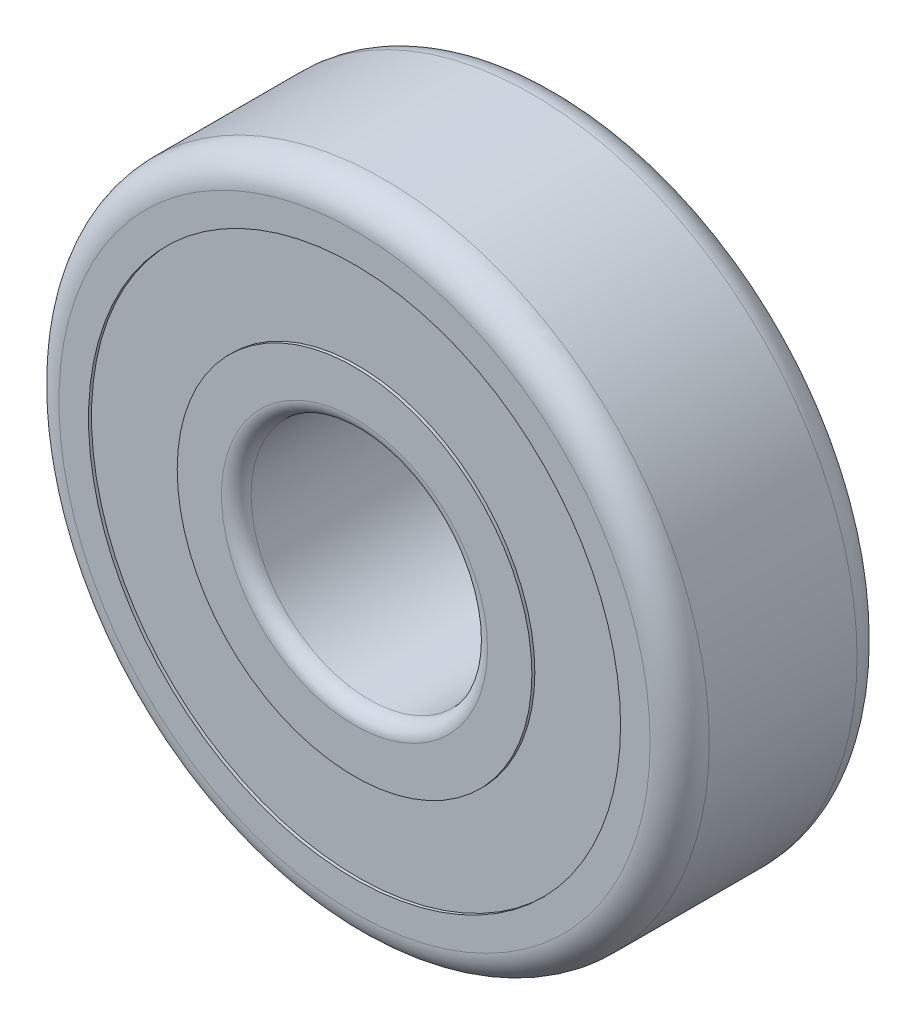
ISO-10303-21;
HEADER;
FILE_DESCRIPTION(('STEP AP214'),'2;1');
FILE_NAME('part.step','',(''),(''),'','','');
FILE_SCHEMA(('AUTOMOTIVE_DESIGN { 1 0 10303 214 1 1 1 1 }'));
ENDSEC;
DATA;
#1=APPLICATION_CONTEXT('core data for automotive mechanical design processes');
#2=APPLICATION_PROTOCOL_DEFINITION('international standard','automotive_design',2000,#1);
#3=PRODUCT_CONTEXT('',#1,'mechanical');
#4=PRODUCT('Part','Part','',(#3));
#5=PRODUCT_RELATED_PRODUCT_CATEGORY('part','',(#4));
#6=PRODUCT_DEFINITION_FORMATION('','',#4);
#7=PRODUCT_DEFINITION_CONTEXT('part definition',#1,'design');
#8=PRODUCT_DEFINITION('design','',#6,#7);
#9=PRODUCT_DEFINITION_SHAPE('','',#8);
#10=(LENGTH_UNIT() NAMED_UNIT(*) SI_UNIT(.MILLI.,.METRE.));
#11=(NAMED_UNIT(*) PLANE_ANGLE_UNIT() SI_UNIT($,.RADIAN.));
#12=(NAMED_UNIT(*) SI_UNIT($,.STERADIAN.) SOLID_ANGLE_UNIT());
#13=UNCERTAINTY_MEASURE_WITH_UNIT(LENGTH_MEASURE(1.E-05),#10,'distance_accuracy_value','');
#14=(GEOMETRIC_REPRESENTATION_CONTEXT(3) GLOBAL_UNCERTAINTY_ASSIGNED_CONTEXT((#13)) GLOBAL_UNIT_ASSIGNED_CONTEXT((#10,
#11,#12)) REPRESENTATION_CONTEXT('',''));
#15=CARTESIAN_POINT('',(0.,0.,0.));
#16=DIRECTION('',(0.,0.,1.));
#17=DIRECTION('',(1.,0.,0.));
#18=AXIS2_PLACEMENT_3D('',#15,#16,#17);
#19=CARTESIAN_POINT('',(0.,0.,0.));
#20=DIRECTION('',(0.,0.,1.));
#21=DIRECTION('',(1.,0.,0.));
#22=AXIS2_PLACEMENT_3D('',#19,#20,#21);
#23=PLANE('',#22);
#24=CARTESIAN_POINT('',(0.,0.,0.));
#25=DIRECTION('',(0.,0.,1.));
#26=DIRECTION('',(1.,0.,0.));
#27=AXIS2_PLACEMENT_3D('',#24,#25,#26);
#28=CIRCLE('',#27,4.5);
#29=CARTESIAN_POINT('',(4.5,0.,0.));
#30=VERTEX_POINT('',#29);
#31=EDGE_CURVE('E39',#30,#30,#28,.T.);
#32=ORIENTED_EDGE('',*,*,#31,.T.);
#33=EDGE_LOOP('',(#32));
#34=FACE_BOUND('',#33,.T.);
#35=CARTESIAN_POINT('',(0.,0.,0.));
#36=DIRECTION('',(0.,0.,-1.));
#37=DIRECTION('',(-1.,0.,0.));
#38=AXIS2_PLACEMENT_3D('',#35,#36,#37);
#39=CIRCLE('',#38,6.);
#40=CARTESIAN_POINT('',(-6.,0.,0.));
#41=VERTEX_POINT('',#40);
#42=EDGE_CURVE('E83',#41,#41,#39,.T.);
#43=ORIENTED_EDGE('',*,*,#42,.T.);
#44=EDGE_LOOP('',(#43));
#45=FACE_BOUND('',#44,.T.);
#46=ADVANCED_FACE('F32',(#34,#45),#23,.F.);
#47=CARTESIAN_POINT('',(0.,0.,7.));
#48=DIRECTION('',(0.,0.,1.));
#49=DIRECTION('',(1.,0.,0.));
#50=AXIS2_PLACEMENT_3D('',#47,#48,#49);
#51=PLANE('',#50);
#52=CARTESIAN_POINT('',(0.,0.,7.));
#53=DIRECTION('',(0.,0.,1.));
#54=DIRECTION('',(1.,0.,0.));
#55=AXIS2_PLACEMENT_3D('',#52,#53,#54);
#56=CIRCLE('',#55,4.5);
#57=CARTESIAN_POINT('',(4.5,0.,7.));
#58=VERTEX_POINT('',#57);
#59=EDGE_CURVE('E43',#58,#58,#56,.F.);
#60=ORIENTED_EDGE('',*,*,#59,.T.);
#61=EDGE_LOOP('',(#60));
#62=FACE_BOUND('',#61,.T.);
#63=CARTESIAN_POINT('',(0.,0.,7.));
#64=DIRECTION('',(0.,0.,1.));
#65=DIRECTION('',(1.,0.,0.));
#66=AXIS2_PLACEMENT_3D('',#63,#64,#65);
#67=CIRCLE('',#66,6.);
#68=CARTESIAN_POINT('',(6.,0.,7.));
#69=VERTEX_POINT('',#68);
#70=EDGE_CURVE('E71',#69,#69,#67,.T.);
#71=ORIENTED_EDGE('',*,*,#70,.T.);
#72=EDGE_LOOP('',(#71));
#73=FACE_BOUND('',#72,.T.);
#74=ADVANCED_FACE('F133',(#62,#73),#51,.T.);
#75=CARTESIAN_POINT('',(0.,0.,7.));
#76=DIRECTION('',(0.,0.,1.));
#77=DIRECTION('',(1.,0.,0.));
#78=AXIS2_PLACEMENT_3D('',#75,#76,#77);
#79=CIRCLE('',#78,9.);
#80=CARTESIAN_POINT('',(9.,0.,7.));
#81=VERTEX_POINT('',#80);
#82=EDGE_CURVE('E65',#81,#81,#79,.T.);
#83=ORIENTED_EDGE('',*,*,#82,.F.);
#84=EDGE_LOOP('',(#83));
#85=FACE_BOUND('',#84,.T.);
#86=CARTESIAN_POINT('',(0.,0.,7.));
#87=DIRECTION('',(0.,0.,1.));
#88=DIRECTION('',(1.,0.,0.));
#89=AXIS2_PLACEMENT_3D('',#86,#87,#88);
#90=CIRCLE('',#89,10.);
#91=CARTESIAN_POINT('',(10.,0.,7.));
#92=VERTEX_POINT('',#91);
#93=EDGE_CURVE('E61',#92,#92,#90,.T.);
#94=ORIENTED_EDGE('',*,*,#93,.T.);
#95=EDGE_LOOP('',(#94));
#96=FACE_BOUND('',#95,.T.);
#97=ADVANCED_FACE('F109',(#85,#96),#51,.T.);
#98=CARTESIAN_POINT('',(0.,0.,0.));
#99=DIRECTION('',(0.,0.,-1.));
#100=DIRECTION('',(-1.,0.,0.));
#101=AXIS2_PLACEMENT_3D('',#98,#99,#100);
#102=CIRCLE('',#101,9.2);
#103=CARTESIAN_POINT('',(-9.2,0.,0.));
#104=VERTEX_POINT('',#103);
#105=EDGE_CURVE('E77',#104,#104,#102,.T.);
#106=ORIENTED_EDGE('',*,*,#105,.F.);
#107=EDGE_LOOP('',(#106));
#108=FACE_BOUND('',#107,.T.);
#109=CARTESIAN_POINT('',(0.,0.,0.));
#110=DIRECTION('',(0.,0.,1.));
#111=DIRECTION('',(1.,0.,0.));
#112=AXIS2_PLACEMENT_3D('',#109,#110,#111);
#113=CIRCLE('',#112,10.);
#114=CARTESIAN_POINT('',(10.,0.,0.));
#115=VERTEX_POINT('',#114);
#116=EDGE_CURVE('E52',#115,#115,#113,.F.);
#117=ORIENTED_EDGE('',*,*,#116,.T.);
#118=EDGE_LOOP('',(#117));
#119=FACE_BOUND('',#118,.T.);
#120=ADVANCED_FACE('F105',(#108,#119),#23,.F.);
#121=CARTESIAN_POINT('',(0.,0.,7.));
#122=DIRECTION('',(0.,0.,-1.));
#123=DIRECTION('',(-1.,0.,0.));
#124=AXIS2_PLACEMENT_3D('',#121,#122,#123);
#125=CYLINDRICAL_SURFACE('',#124,11.);
#126=CARTESIAN_POINT('',(0.,0.,1.));
#127=DIRECTION('',(0.,0.,1.));
#128=DIRECTION('',(1.,0.,0.));
#129=AXIS2_PLACEMENT_3D('',#126,#127,#128);
#130=CIRCLE('',#129,11.);
#131=CARTESIAN_POINT('',(-11.,0.,1.));
#132=VERTEX_POINT('',#131);
#133=EDGE_CURVE('E55',#132,#132,#130,.T.);
#134=CARTESIAN_POINT('',(0.,0.,6.));
#135=DIRECTION('',(0.,0.,1.));
#136=DIRECTION('',(1.,0.,0.));
#137=AXIS2_PLACEMENT_3D('',#134,#135,#136);
#138=CIRCLE('',#137,11.);
#139=CARTESIAN_POINT('',(-11.,0.,6.));
#140=VERTEX_POINT('',#139);
#141=EDGE_CURVE('E58',#140,#140,#138,.F.);
#142=CARTESIAN_POINT('',(-11.,0.,1.));
#143=CARTESIAN_POINT('',(-11.,0.,1.05208333333333));
#144=CARTESIAN_POINT('',(-11.,0.,1.10416666666667));
#145=CARTESIAN_POINT('',(-11.,0.,1.20833333333333));
#146=CARTESIAN_POINT('',(-11.,0.,1.26041666666667));
#147=CARTESIAN_POINT('',(-11.,0.,1.36458333333333));
#148=CARTESIAN_POINT('',(-11.,0.,1.41666666666667));
#149=CARTESIAN_POINT('',(-11.,0.,1.52083333333333));
#150=CARTESIAN_POINT('',(-11.,0.,1.57291666666667));
#151=CARTESIAN_POINT('',(-11.,0.,1.67708333333333));
#152=CARTESIAN_POINT('',(-11.,0.,1.72916666666667));
#153=CARTESIAN_POINT('',(-11.,0.,1.83333333333333));
#154=CARTESIAN_POINT('',(-11.,0.,1.88541666666667));
#155=CARTESIAN_POINT('',(-11.,0.,1.98958333333333));
#156=CARTESIAN_POINT('',(-11.,0.,2.04166666666667));
#157=CARTESIAN_POINT('',(-11.,0.,2.14583333333333));
#158=CARTESIAN_POINT('',(-11.,0.,2.19791666666667));
#159=CARTESIAN_POINT('',(-11.,0.,2.30208333333333));
#160=CARTESIAN_POINT('',(-11.,0.,2.35416666666667));
#161=CARTESIAN_POINT('',(-11.,0.,2.45833333333333));
#162=CARTESIAN_POINT('',(-11.,0.,2.51041666666667));
#163=CARTESIAN_POINT('',(-11.,0.,2.61458333333333));
#164=CARTESIAN_POINT('',(-11.,0.,2.66666666666667));
#165=CARTESIAN_POINT('',(-11.,0.,2.77083333333333));
#166=CARTESIAN_POINT('',(-11.,0.,2.82291666666667));
#167=CARTESIAN_POINT('',(-11.,0.,2.92708333333333));
#168=CARTESIAN_POINT('',(-11.,0.,2.97916666666667));
#169=CARTESIAN_POINT('',(-11.,0.,3.08333333333333));
#170=CARTESIAN_POINT('',(-11.,0.,3.13541666666667));
#171=CARTESIAN_POINT('',(-11.,0.,3.23958333333333));
#172=CARTESIAN_POINT('',(-11.,0.,3.29166666666667));
#173=CARTESIAN_POINT('',(-11.,0.,3.39583333333333));
#174=CARTESIAN_POINT('',(-11.,0.,3.44791666666667));
#175=CARTESIAN_POINT('',(-11.,0.,3.55208333333333));
#176=CARTESIAN_POINT('',(-11.,0.,3.60416666666667));
#177=CARTESIAN_POINT('',(-11.,0.,3.70833333333333));
#178=CARTESIAN_POINT('',(-11.,0.,3.76041666666667));
#179=CARTESIAN_POINT('',(-11.,0.,3.86458333333333));
#180=CARTESIAN_POINT('',(-11.,0.,3.91666666666667));
#181=CARTESIAN_POINT('',(-11.,0.,4.02083333333333));
#182=CARTESIAN_POINT('',(-11.,0.,4.07291666666667));
#183=CARTESIAN_POINT('',(-11.,0.,4.17708333333333));
#184=CARTESIAN_POINT('',(-11.,0.,4.22916666666667));
#185=CARTESIAN_POINT('',(-11.,0.,4.33333333333333));
#186=CARTESIAN_POINT('',(-11.,0.,4.38541666666667));
#187=CARTESIAN_POINT('',(-11.,0.,4.48958333333333));
#188=CARTESIAN_POINT('',(-11.,0.,4.54166666666667));
#189=CARTESIAN_POINT('',(-11.,0.,4.64583333333333));
#190=CARTESIAN_POINT('',(-11.,0.,4.69791666666667));
#191=CARTESIAN_POINT('',(-11.,0.,4.80208333333333));
#192=CARTESIAN_POINT('',(-11.,0.,4.85416666666667));
#193=CARTESIAN_POINT('',(-11.,0.,4.95833333333333));
#194=CARTESIAN_POINT('',(-11.,0.,5.01041666666667));
#195=CARTESIAN_POINT('',(-11.,0.,5.11458333333333));
#196=CARTESIAN_POINT('',(-11.,0.,5.16666666666667));
#197=CARTESIAN_POINT('',(-11.,0.,5.27083333333333));
#198=CARTESIAN_POINT('',(-11.,0.,5.32291666666667));
#199=CARTESIAN_POINT('',(-11.,0.,5.42708333333333));
#200=CARTESIAN_POINT('',(-11.,0.,5.47916666666667));
#201=CARTESIAN_POINT('',(-11.,0.,5.58333333333333));
#202=CARTESIAN_POINT('',(-11.,0.,5.63541666666667));
#203=CARTESIAN_POINT('',(-11.,0.,5.73958333333333));
#204=CARTESIAN_POINT('',(-11.,0.,5.79166666666666));
#205=CARTESIAN_POINT('',(-11.,0.,5.89583333333333));
#206=CARTESIAN_POINT('',(-11.,0.,5.94791666666666));
#207=CARTESIAN_POINT('',(-11.,0.,6.));
#208=B_SPLINE_CURVE_WITH_KNOTS('',3,(#142,#143,#144,#145,#146,#147,#148,#149,#150,#151,#152,
#153,#154,#155,#156,#157,#158,#159,#160,#161,#162,#163,#164,#165,#166,#167,#168,#169,#170,#171,
#172,#173,#174,#175,#176,#177,#178,#179,#180,#181,#182,#183,#184,#185,#186,#187,#188,#189,#190,
#191,#192,#193,#194,#195,#196,#197,#198,#199,#200,#201,#202,#203,#204,#205,#206,#207),
.UNSPECIFIED.,.F.,.F.,(4,2,2,2,2,2,2,2,2,2,2,2,2,2,2,2,2,2,2,2,2,2,2,2,2,2,2,2,2,2,2,2,4),(0.,
0.15625,0.3125,0.46875,0.625,0.78125,0.9375,1.09375,1.25,1.40625,1.5625,1.71875,1.875,2.03125,
2.1875,2.34375,2.5,2.65625,2.8125,2.96875,3.125,3.28125,3.4375,3.59375,3.75,3.90625,4.0625,
4.21875,4.375,4.53125,4.6875,4.84375,5.),.UNSPECIFIED.);
#209=EDGE_CURVE('BSEAM108',#132,#140,#208,.T.);
#210=ORIENTED_EDGE('',*,*,#133,.T.);
#211=ORIENTED_EDGE('',*,*,#141,.T.);
#212=ORIENTED_EDGE('',*,*,#209,.T.);
#213=ORIENTED_EDGE('',*,*,#209,.F.);
#214=EDGE_LOOP('',(#210,#212,#211,#213));
#215=FACE_BOUND('',#214,.T.);
#216=ADVANCED_FACE('F108',(#215),#125,.T.);
#217=CARTESIAN_POINT('',(0.,0.,7.));
#218=DIRECTION('',(0.,0.,-1.));
#219=DIRECTION('',(-1.,0.,0.));
#220=AXIS2_PLACEMENT_3D('',#217,#218,#219);
#221=CYLINDRICAL_SURFACE('',#220,4.);
#222=CARTESIAN_POINT('',(0.,0.,0.5));
#223=DIRECTION('',(0.,0.,1.));
#224=DIRECTION('',(1.,0.,0.));
#225=AXIS2_PLACEMENT_3D('',#222,#223,#224);
#226=CIRCLE('',#225,4.);
#227=CARTESIAN_POINT('',(-4.,0.,0.5));
#228=VERTEX_POINT('',#227);
#229=EDGE_CURVE('E10',#228,#228,#226,.F.);
#230=CARTESIAN_POINT('',(0.,0.,6.5));
#231=DIRECTION('',(0.,0.,1.));
#232=DIRECTION('',(1.,0.,0.));
#233=AXIS2_PLACEMENT_3D('',#230,#231,#232);
#234=CIRCLE('',#233,4.);
#235=CARTESIAN_POINT('',(-4.,0.,6.5));
#236=VERTEX_POINT('',#235);
#237=EDGE_CURVE('E47',#236,#236,#234,.T.);
#238=CARTESIAN_POINT('',(-4.,0.,0.5));
#239=CARTESIAN_POINT('',(-4.,0.,0.5625));
#240=CARTESIAN_POINT('',(-4.,0.,0.625));
#241=CARTESIAN_POINT('',(-4.,0.,0.75));
#242=CARTESIAN_POINT('',(-4.,0.,0.8125));
#243=CARTESIAN_POINT('',(-4.,0.,0.9375));
#244=CARTESIAN_POINT('',(-4.,0.,0.999999999999999));
#245=CARTESIAN_POINT('',(-4.,0.,1.125));
#246=CARTESIAN_POINT('',(-4.,0.,1.1875));
#247=CARTESIAN_POINT('',(-4.,0.,1.3125));
#248=CARTESIAN_POINT('',(-4.,0.,1.375));
#249=CARTESIAN_POINT('',(-4.,0.,1.5));
#250=CARTESIAN_POINT('',(-4.,0.,1.5625));
#251=CARTESIAN_POINT('',(-4.,0.,1.6875));
#252=CARTESIAN_POINT('',(-4.,0.,1.75));
#253=CARTESIAN_POINT('',(-4.,0.,1.875));
#254=CARTESIAN_POINT('',(-4.,0.,1.9375));
#255=CARTESIAN_POINT('',(-4.,0.,2.0625));
#256=CARTESIAN_POINT('',(-4.,0.,2.125));
#257=CARTESIAN_POINT('',(-4.,0.,2.25));
#258=CARTESIAN_POINT('',(-4.,0.,2.3125));
#259=CARTESIAN_POINT('',(-4.,0.,2.4375));
#260=CARTESIAN_POINT('',(-4.,0.,2.5));
#261=CARTESIAN_POINT('',(-4.,0.,2.625));
#262=CARTESIAN_POINT('',(-4.,0.,2.6875));
#263=CARTESIAN_POINT('',(-4.,0.,2.8125));
#264=CARTESIAN_POINT('',(-4.,0.,2.875));
#265=CARTESIAN_POINT('',(-4.,0.,3.));
#266=CARTESIAN_POINT('',(-4.,0.,3.0625));
#267=CARTESIAN_POINT('',(-4.,0.,3.1875));
#268=CARTESIAN_POINT('',(-4.,0.,3.25));
#269=CARTESIAN_POINT('',(-4.,0.,3.375));
#270=CARTESIAN_POINT('',(-4.,0.,3.4375));
#271=CARTESIAN_POINT('',(-4.,0.,3.5625));
#272=CARTESIAN_POINT('',(-4.,0.,3.625));
#273=CARTESIAN_POINT('',(-4.,0.,3.75));
#274=CARTESIAN_POINT('',(-4.,0.,3.8125));
#275=CARTESIAN_POINT('',(-4.,0.,3.9375));
#276=CARTESIAN_POINT('',(-4.,0.,4.));
#277=CARTESIAN_POINT('',(-4.,0.,4.125));
#278=CARTESIAN_POINT('',(-4.,0.,4.1875));
#279=CARTESIAN_POINT('',(-4.,0.,4.3125));
#280=CARTESIAN_POINT('',(-4.,0.,4.375));
#281=CARTESIAN_POINT('',(-4.,0.,4.5));
#282=CARTESIAN_POINT('',(-4.,0.,4.5625));
#283=CARTESIAN_POINT('',(-4.,0.,4.6875));
#284=CARTESIAN_POINT('',(-4.,0.,4.75));
#285=CARTESIAN_POINT('',(-4.,0.,4.875));
#286=CARTESIAN_POINT('',(-4.,0.,4.9375));
#287=CARTESIAN_POINT('',(-4.,0.,5.0625));
#288=CARTESIAN_POINT('',(-4.,0.,5.125));
#289=CARTESIAN_POINT('',(-4.,0.,5.25));
#290=CARTESIAN_POINT('',(-4.,0.,5.3125));
#291=CARTESIAN_POINT('',(-4.,0.,5.4375));
#292=CARTESIAN_POINT('',(-4.,0.,5.5));
#293=CARTESIAN_POINT('',(-4.,0.,5.625));
#294=CARTESIAN_POINT('',(-4.,0.,5.6875));
#295=CARTESIAN_POINT('',(-4.,0.,5.8125));
#296=CARTESIAN_POINT('',(-4.,0.,5.875));
#297=CARTESIAN_POINT('',(-4.,0.,6.));
#298=CARTESIAN_POINT('',(-4.,0.,6.0625));
#299=CARTESIAN_POINT('',(-4.,0.,6.1875));
#300=CARTESIAN_POINT('',(-4.,0.,6.25));
#301=CARTESIAN_POINT('',(-4.,0.,6.375));
#302=CARTESIAN_POINT('',(-4.,0.,6.4375));
#303=CARTESIAN_POINT('',(-4.,0.,6.5));
#304=B_SPLINE_CURVE_WITH_KNOTS('',3,(#238,#239,#240,#241,#242,#243,#244,#245,#246,#247,#248,
#249,#250,#251,#252,#253,#254,#255,#256,#257,#258,#259,#260,#261,#262,#263,#264,#265,#266,#267,
#268,#269,#270,#271,#272,#273,#274,#275,#276,#277,#278,#279,#280,#281,#282,#283,#284,#285,#286,
#287,#288,#289,#290,#291,#292,#293,#294,#295,#296,#297,#298,#299,#300,#301,#302,#303),
.UNSPECIFIED.,.F.,.F.,(4,2,2,2,2,2,2,2,2,2,2,2,2,2,2,2,2,2,2,2,2,2,2,2,2,2,2,2,2,2,2,2,4),(0.,
0.1875,0.375,0.5625,0.75,0.9375,1.125,1.3125,1.5,1.6875,1.875,2.0625,2.25,2.4375,2.625,2.8125,
3.,3.1875,3.375,3.5625,3.75,3.9375,4.125,4.3125,4.5,4.6875,4.875,5.0625,5.25,5.4375,5.625,
5.8125,6.),.UNSPECIFIED.);
#305=EDGE_CURVE('BSEAM123',#228,#236,#304,.T.);
#306=ORIENTED_EDGE('',*,*,#229,.T.);
#307=ORIENTED_EDGE('',*,*,#237,.T.);
#308=ORIENTED_EDGE('',*,*,#305,.T.);
#309=ORIENTED_EDGE('',*,*,#305,.F.);
#310=EDGE_LOOP('',(#306,#308,#307,#309));
#311=FACE_BOUND('',#310,.T.);
#312=ADVANCED_FACE('F123',(#311),#221,.F.);
#313=CARTESIAN_POINT('',(0.,0.,6.));
#314=DIRECTION('',(0.,0.,1.));
#315=DIRECTION('',(1.,0.,0.));
#316=AXIS2_PLACEMENT_3D('',#313,#314,#315);
#317=TOROIDAL_SURFACE('',#316,10.,1.);
#318=ORIENTED_EDGE('',*,*,#141,.F.);
#319=EDGE_LOOP('',(#318));
#320=FACE_BOUND('',#319,.T.);
#321=ORIENTED_EDGE('',*,*,#93,.F.);
#322=EDGE_LOOP('',(#321));
#323=FACE_BOUND('',#322,.T.);
#324=ADVANCED_FACE('F117',(#320,#323),#317,.T.);
#325=CARTESIAN_POINT('',(0.,0.,1.));
#326=DIRECTION('',(0.,0.,1.));
#327=DIRECTION('',(1.,0.,0.));
#328=AXIS2_PLACEMENT_3D('',#325,#326,#327);
#329=TOROIDAL_SURFACE('',#328,10.,1.);
#330=ORIENTED_EDGE('',*,*,#116,.F.);
#331=EDGE_LOOP('',(#330));
#332=FACE_BOUND('',#331,.T.);
#333=ORIENTED_EDGE('',*,*,#133,.F.);
#334=EDGE_LOOP('',(#333));
#335=FACE_BOUND('',#334,.T.);
#336=ADVANCED_FACE('F113',(#332,#335),#329,.T.);
#337=CARTESIAN_POINT('',(0.,0.,6.5));
#338=DIRECTION('',(0.,0.,1.));
#339=DIRECTION('',(1.,0.,0.));
#340=AXIS2_PLACEMENT_3D('',#337,#338,#339);
#341=TOROIDAL_SURFACE('',#340,4.5,0.5);
#342=ORIENTED_EDGE('',*,*,#59,.F.);
#343=EDGE_LOOP('',(#342));
#344=FACE_BOUND('',#343,.T.);
#345=ORIENTED_EDGE('',*,*,#237,.F.);
#346=EDGE_LOOP('',(#345));
#347=FACE_BOUND('',#346,.T.);
#348=ADVANCED_FACE('F116',(#344,#347),#341,.T.);
#349=CARTESIAN_POINT('',(0.,0.,0.5));
#350=DIRECTION('',(0.,0.,1.));
#351=DIRECTION('',(1.,0.,0.));
#352=AXIS2_PLACEMENT_3D('',#349,#350,#351);
#353=TOROIDAL_SURFACE('',#352,4.5,0.5);
#354=ORIENTED_EDGE('',*,*,#229,.F.);
#355=EDGE_LOOP('',(#354));
#356=FACE_BOUND('',#355,.T.);
#357=ORIENTED_EDGE('',*,*,#31,.F.);
#358=EDGE_LOOP('',(#357));
#359=FACE_BOUND('',#358,.T.);
#360=ADVANCED_FACE('F34',(#356,#359),#353,.T.);
#361=CARTESIAN_POINT('',(0.,0.,6.9));
#362=DIRECTION('',(0.,0.,1.));
#363=DIRECTION('',(1.,0.,0.));
#364=AXIS2_PLACEMENT_3D('',#361,#362,#363);
#365=CYLINDRICAL_SURFACE('',#364,9.);
#366=CARTESIAN_POINT('',(0.,0.,6.9));
#367=DIRECTION('',(0.,0.,1.));
#368=DIRECTION('',(1.,0.,0.));
#369=AXIS2_PLACEMENT_3D('',#366,#367,#368);
#370=CIRCLE('',#369,9.);
#371=CARTESIAN_POINT('',(9.,0.,6.9));
#372=VERTEX_POINT('',#371);
#373=EDGE_CURVE('E64',#372,#372,#370,.T.);
#374=ORIENTED_EDGE('',*,*,#373,.F.);
#375=EDGE_LOOP('',(#374));
#376=FACE_BOUND('',#375,.T.);
#377=ORIENTED_EDGE('',*,*,#82,.T.);
#378=EDGE_LOOP('',(#377));
#379=FACE_BOUND('',#378,.T.);
#380=ADVANCED_FACE('F151',(#376,#379),#365,.F.);
#381=CARTESIAN_POINT('',(0.,0.,6.9));
#382=DIRECTION('',(0.,0.,1.));
#383=DIRECTION('',(1.,0.,0.));
#384=AXIS2_PLACEMENT_3D('',#381,#382,#383);
#385=PLANE('',#384);
#386=CARTESIAN_POINT('',(0.,0.,6.9));
#387=DIRECTION('',(0.,0.,1.));
#388=DIRECTION('',(1.,0.,0.));
#389=AXIS2_PLACEMENT_3D('',#386,#387,#388);
#390=CIRCLE('',#389,6.);
#391=CARTESIAN_POINT('',(6.,0.,6.9));
#392=VERTEX_POINT('',#391);
#393=EDGE_CURVE('E68',#392,#392,#390,.T.);
#394=ORIENTED_EDGE('',*,*,#393,.F.);
#395=EDGE_LOOP('',(#394));
#396=FACE_BOUND('',#395,.T.);
#397=ORIENTED_EDGE('',*,*,#373,.T.);
#398=EDGE_LOOP('',(#397));
#399=FACE_BOUND('',#398,.T.);
#400=ADVANCED_FACE('F163',(#396,#399),#385,.T.);
#401=CARTESIAN_POINT('',(0.,0.,6.9));
#402=DIRECTION('',(0.,0.,1.));
#403=DIRECTION('',(1.,0.,0.));
#404=AXIS2_PLACEMENT_3D('',#401,#402,#403);
#405=CYLINDRICAL_SURFACE('',#404,6.);
#406=ORIENTED_EDGE('',*,*,#393,.T.);
#407=EDGE_LOOP('',(#406));
#408=FACE_BOUND('',#407,.T.);
#409=ORIENTED_EDGE('',*,*,#70,.F.);
#410=EDGE_LOOP('',(#409));
#411=FACE_BOUND('',#410,.T.);
#412=ADVANCED_FACE('F101',(#408,#411),#405,.T.);
#413=CARTESIAN_POINT('',(0.,0.,0.1));
#414=DIRECTION('',(0.,0.,-1.));
#415=DIRECTION('',(-1.,0.,0.));
#416=AXIS2_PLACEMENT_3D('',#413,#414,#415);
#417=CYLINDRICAL_SURFACE('',#416,9.2);
#418=CARTESIAN_POINT('',(0.,0.,0.1));
#419=DIRECTION('',(0.,0.,-1.));
#420=DIRECTION('',(-1.,0.,0.));
#421=AXIS2_PLACEMENT_3D('',#418,#419,#420);
#422=CIRCLE('',#421,9.2);
#423=CARTESIAN_POINT('',(-9.2,0.,0.1));
#424=VERTEX_POINT('',#423);
#425=EDGE_CURVE('E74',#424,#424,#422,.T.);
#426=ORIENTED_EDGE('',*,*,#425,.F.);
#427=EDGE_LOOP('',(#426));
#428=FACE_BOUND('',#427,.T.);
#429=ORIENTED_EDGE('',*,*,#105,.T.);
#430=EDGE_LOOP('',(#429));
#431=FACE_BOUND('',#430,.T.);
#432=ADVANCED_FACE('F95',(#428,#431),#417,.F.);
#433=CARTESIAN_POINT('',(0.,0.,0.1));
#434=DIRECTION('',(0.,0.,-1.));
#435=DIRECTION('',(-1.,0.,0.));
#436=AXIS2_PLACEMENT_3D('',#433,#434,#435);
#437=PLANE('',#436);
#438=CARTESIAN_POINT('',(0.,0.,0.1));
#439=DIRECTION('',(0.,0.,-1.));
#440=DIRECTION('',(-1.,0.,0.));
#441=AXIS2_PLACEMENT_3D('',#438,#439,#440);
#442=CIRCLE('',#441,6.);
#443=CARTESIAN_POINT('',(-6.,0.,0.1));
#444=VERTEX_POINT('',#443);
#445=EDGE_CURVE('E80',#444,#444,#442,.T.);
#446=ORIENTED_EDGE('',*,*,#445,.F.);
#447=EDGE_LOOP('',(#446));
#448=FACE_BOUND('',#447,.T.);
#449=ORIENTED_EDGE('',*,*,#425,.T.);
#450=EDGE_LOOP('',(#449));
#451=FACE_BOUND('',#450,.T.);
#452=ADVANCED_FACE('F92',(#448,#451),#437,.T.);
#453=CARTESIAN_POINT('',(0.,0.,0.1));
#454=DIRECTION('',(0.,0.,-1.));
#455=DIRECTION('',(-1.,0.,0.));
#456=AXIS2_PLACEMENT_3D('',#453,#454,#455);
#457=CYLINDRICAL_SURFACE('',#456,6.);
#458=ORIENTED_EDGE('',*,*,#445,.T.);
#459=EDGE_LOOP('',(#458));
#460=FACE_BOUND('',#459,.T.);
#461=ORIENTED_EDGE('',*,*,#42,.F.);
#462=EDGE_LOOP('',(#461));
#463=FACE_BOUND('',#462,.T.);
#464=ADVANCED_FACE('F89',(#460,#463),#457,.T.);
#465=CLOSED_SHELL('',(#46,#74,#97,#120,#216,#312,#324,#336,#348,#360,#380,#400,#412,#432,#452,#464));
#466=MANIFOLD_SOLID_BREP('B2',#465);
#467=ADVANCED_BREP_SHAPE_REPRESENTATION('',(#18,#466),#14);
#468=SHAPE_DEFINITION_REPRESENTATION(#9,#467);
ENDSEC;
END-ISO-10303-21;
